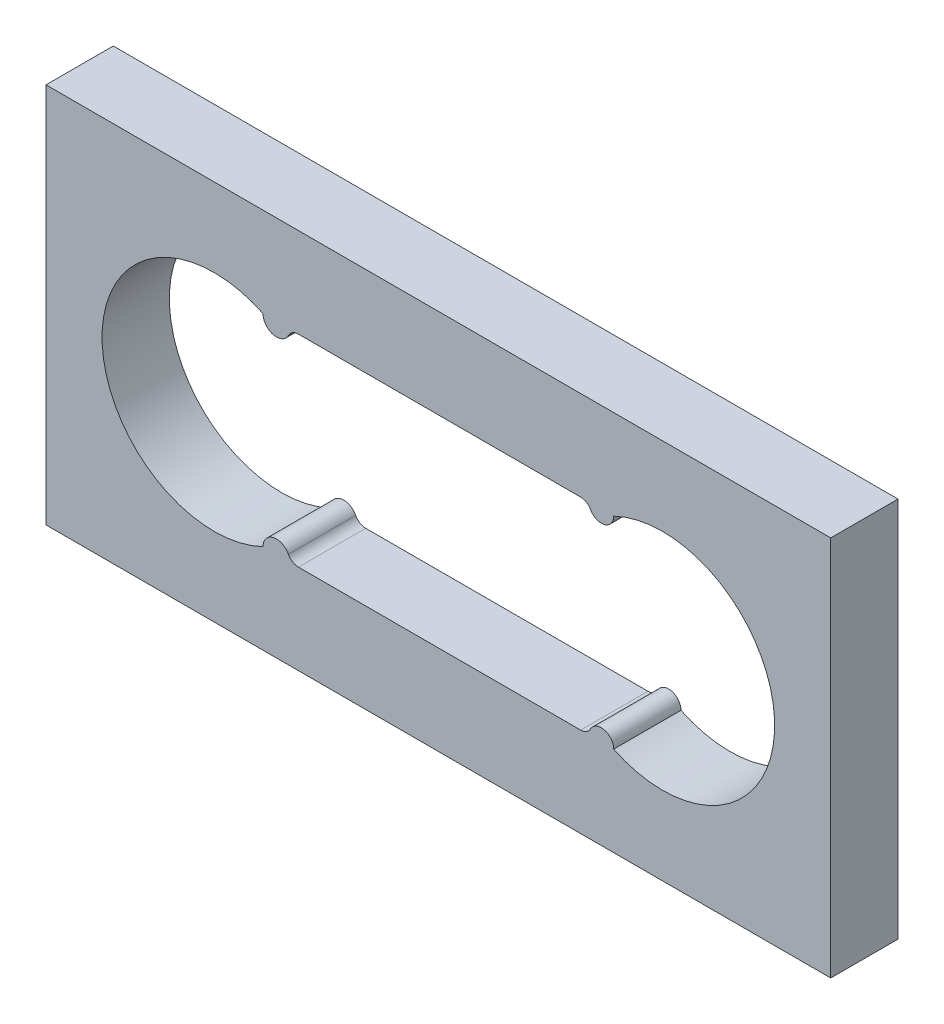
ISO-10303-21;
HEADER;
FILE_DESCRIPTION(('STEP AP214'),'2;1');
FILE_NAME('part.step','',(''),(''),'','','');
FILE_SCHEMA(('AUTOMOTIVE_DESIGN { 1 0 10303 214 1 1 1 1 }'));
ENDSEC;
DATA;
#1=APPLICATION_CONTEXT('core data for automotive mechanical design processes');
#2=APPLICATION_PROTOCOL_DEFINITION('international standard','automotive_design',2000,#1);
#3=PRODUCT_CONTEXT('',#1,'mechanical');
#4=PRODUCT('Part','Part','',(#3));
#5=PRODUCT_RELATED_PRODUCT_CATEGORY('part','',(#4));
#6=PRODUCT_DEFINITION_FORMATION('','',#4);
#7=PRODUCT_DEFINITION_CONTEXT('part definition',#1,'design');
#8=PRODUCT_DEFINITION('design','',#6,#7);
#9=PRODUCT_DEFINITION_SHAPE('','',#8);
#10=(LENGTH_UNIT() NAMED_UNIT(*) SI_UNIT(.MILLI.,.METRE.));
#11=(NAMED_UNIT(*) PLANE_ANGLE_UNIT() SI_UNIT($,.RADIAN.));
#12=(NAMED_UNIT(*) SI_UNIT($,.STERADIAN.) SOLID_ANGLE_UNIT());
#13=UNCERTAINTY_MEASURE_WITH_UNIT(LENGTH_MEASURE(1.E-05),#10,'distance_accuracy_value','');
#14=(GEOMETRIC_REPRESENTATION_CONTEXT(3) GLOBAL_UNCERTAINTY_ASSIGNED_CONTEXT((#13)) GLOBAL_UNIT_ASSIGNED_CONTEXT((#10,
#11,#12)) REPRESENTATION_CONTEXT('',''));
#15=CARTESIAN_POINT('',(0.,0.,0.));
#16=DIRECTION('',(0.,0.,1.));
#17=DIRECTION('',(1.,0.,0.));
#18=AXIS2_PLACEMENT_3D('',#15,#16,#17);
#19=CARTESIAN_POINT('',(0.,-8.5,3.));
#20=DIRECTION('',(0.,1.,0.));
#21=DIRECTION('',(0.,0.,1.));
#22=AXIS2_PLACEMENT_3D('',#19,#20,#21);
#23=PLANE('',#22);
#24=DIRECTION('',(1.,0.,0.));
#25=VECTOR('',#24,1.);
#26=CARTESIAN_POINT('',(0.,-8.5,0.));
#27=LINE('',#26,#25);
#28=CARTESIAN_POINT('',(-17.5,-8.5,0.));
#29=VERTEX_POINT('',#28);
#30=CARTESIAN_POINT('',(17.5,-8.5,0.));
#31=VERTEX_POINT('',#30);
#32=EDGE_CURVE('E204',#29,#31,#27,.T.);
#33=ORIENTED_EDGE('',*,*,#32,.T.);
#34=DIRECTION('',(0.,0.,-1.));
#35=VECTOR('',#34,1.);
#36=CARTESIAN_POINT('',(17.5,-8.5,3.));
#37=LINE('',#36,#35);
#38=CARTESIAN_POINT('',(17.5,-8.5,3.));
#39=VERTEX_POINT('',#38);
#40=EDGE_CURVE('E230',#39,#31,#37,.T.);
#41=ORIENTED_EDGE('',*,*,#40,.F.);
#42=DIRECTION('',(1.,0.,0.));
#43=VECTOR('',#42,1.);
#44=CARTESIAN_POINT('',(0.,-8.5,3.));
#45=LINE('',#44,#43);
#46=CARTESIAN_POINT('',(-17.5,-8.5,3.));
#47=VERTEX_POINT('',#46);
#48=EDGE_CURVE('E294',#47,#39,#45,.T.);
#49=ORIENTED_EDGE('',*,*,#48,.F.);
#50=DIRECTION('',(0.,0.,-1.));
#51=VECTOR('',#50,1.);
#52=CARTESIAN_POINT('',(-17.5,-8.5,3.));
#53=LINE('',#52,#51);
#54=EDGE_CURVE('E220',#47,#29,#53,.T.);
#55=ORIENTED_EDGE('',*,*,#54,.T.);
#56=EDGE_LOOP('',(#33,#41,#49,#55));
#57=FACE_BOUND('',#56,.T.);
#58=ADVANCED_FACE('F41',(#57),#23,.F.);
#59=CARTESIAN_POINT('',(17.5,0.,3.));
#60=DIRECTION('',(-1.,0.,0.));
#61=DIRECTION('',(0.,0.,1.));
#62=AXIS2_PLACEMENT_3D('',#59,#60,#61);
#63=PLANE('',#62);
#64=DIRECTION('',(0.,1.,0.));
#65=VECTOR('',#64,1.);
#66=CARTESIAN_POINT('',(17.5,0.,0.));
#67=LINE('',#66,#65);
#68=CARTESIAN_POINT('',(17.5,8.5,0.));
#69=VERTEX_POINT('',#68);
#70=EDGE_CURVE('E208',#31,#69,#67,.T.);
#71=ORIENTED_EDGE('',*,*,#70,.T.);
#72=DIRECTION('',(0.,0.,-1.));
#73=VECTOR('',#72,1.);
#74=CARTESIAN_POINT('',(17.5,8.5,3.));
#75=LINE('',#74,#73);
#76=CARTESIAN_POINT('',(17.5,8.5,3.));
#77=VERTEX_POINT('',#76);
#78=EDGE_CURVE('E227',#77,#69,#75,.T.);
#79=ORIENTED_EDGE('',*,*,#78,.F.);
#80=DIRECTION('',(0.,1.,0.));
#81=VECTOR('',#80,1.);
#82=CARTESIAN_POINT('',(17.5,0.,3.));
#83=LINE('',#82,#81);
#84=EDGE_CURVE('E292',#39,#77,#83,.T.);
#85=ORIENTED_EDGE('',*,*,#84,.F.);
#86=ORIENTED_EDGE('',*,*,#40,.T.);
#87=EDGE_LOOP('',(#71,#79,#85,#86));
#88=FACE_BOUND('',#87,.T.);
#89=ADVANCED_FACE('F376',(#88),#63,.F.);
#90=CARTESIAN_POINT('',(0.,8.5,3.));
#91=DIRECTION('',(0.,1.,0.));
#92=DIRECTION('',(0.,0.,1.));
#93=AXIS2_PLACEMENT_3D('',#90,#91,#92);
#94=PLANE('',#93);
#95=DIRECTION('',(1.,0.,0.));
#96=VECTOR('',#95,1.);
#97=CARTESIAN_POINT('',(0.,8.5,0.));
#98=LINE('',#97,#96);
#99=CARTESIAN_POINT('',(-17.5,8.5,0.));
#100=VERTEX_POINT('',#99);
#101=EDGE_CURVE('E212',#100,#69,#98,.T.);
#102=ORIENTED_EDGE('',*,*,#101,.F.);
#103=DIRECTION('',(0.,0.,-1.));
#104=VECTOR('',#103,1.);
#105=CARTESIAN_POINT('',(-17.5,8.5,3.));
#106=LINE('',#105,#104);
#107=CARTESIAN_POINT('',(-17.5,8.5,3.));
#108=VERTEX_POINT('',#107);
#109=EDGE_CURVE('E223',#108,#100,#106,.T.);
#110=ORIENTED_EDGE('',*,*,#109,.F.);
#111=DIRECTION('',(1.,0.,0.));
#112=VECTOR('',#111,1.);
#113=CARTESIAN_POINT('',(0.,8.5,3.));
#114=LINE('',#113,#112);
#115=EDGE_CURVE('E289',#108,#77,#114,.T.);
#116=ORIENTED_EDGE('',*,*,#115,.T.);
#117=ORIENTED_EDGE('',*,*,#78,.T.);
#118=EDGE_LOOP('',(#102,#110,#116,#117));
#119=FACE_BOUND('',#118,.T.);
#120=ADVANCED_FACE('F382',(#119),#94,.T.);
#121=CARTESIAN_POINT('',(10.,0.,3.));
#122=DIRECTION('',(0.,0.,-1.));
#123=DIRECTION('',(-1.,0.,0.));
#124=AXIS2_PLACEMENT_3D('',#121,#122,#123);
#125=CYLINDRICAL_SURFACE('',#124,5.);
#126=CARTESIAN_POINT('',(10.,0.,0.));
#127=DIRECTION('',(0.,0.,1.));
#128=DIRECTION('',(1.,0.,0.));
#129=AXIS2_PLACEMENT_3D('',#126,#127,#128);
#130=CIRCLE('',#129,5.);
#131=CARTESIAN_POINT('',(7.82055052822967,-4.5,0.));
#132=VERTEX_POINT('',#131);
#133=CARTESIAN_POINT('',(7.82055052822966,4.5,0.));
#134=VERTEX_POINT('',#133);
#135=EDGE_CURVE('E171',#132,#134,#130,.T.);
#136=ORIENTED_EDGE('',*,*,#135,.F.);
#137=DIRECTION('',(0.,0.,-1.));
#138=VECTOR('',#137,1.);
#139=CARTESIAN_POINT('',(7.82055052822967,-4.5,3.));
#140=LINE('',#139,#138);
#141=CARTESIAN_POINT('',(7.82055052822967,-4.5,3.));
#142=VERTEX_POINT('',#141);
#143=EDGE_CURVE('E224',#142,#132,#140,.T.);
#144=ORIENTED_EDGE('',*,*,#143,.F.);
#145=CARTESIAN_POINT('',(10.,0.,3.));
#146=DIRECTION('',(0.,0.,1.));
#147=DIRECTION('',(1.,0.,0.));
#148=AXIS2_PLACEMENT_3D('',#145,#146,#147);
#149=CIRCLE('',#148,5.);
#150=CARTESIAN_POINT('',(7.82055052822966,4.5,3.));
#151=VERTEX_POINT('',#150);
#152=EDGE_CURVE('E173',#142,#151,#149,.T.);
#153=ORIENTED_EDGE('',*,*,#152,.T.);
#154=DIRECTION('',(0.,0.,-1.));
#155=VECTOR('',#154,1.);
#156=CARTESIAN_POINT('',(7.82055052822966,4.5,3.));
#157=LINE('',#156,#155);
#158=EDGE_CURVE('E158',#151,#134,#157,.T.);
#159=ORIENTED_EDGE('',*,*,#158,.T.);
#160=EDGE_LOOP('',(#136,#144,#153,#159));
#161=FACE_BOUND('',#160,.T.);
#162=ADVANCED_FACE('F169',(#161),#125,.F.);
#163=CARTESIAN_POINT('',(0.,-4.5,3.));
#164=DIRECTION('',(0.,1.,0.));
#165=DIRECTION('',(0.,0.,1.));
#166=AXIS2_PLACEMENT_3D('',#163,#164,#165);
#167=PLANE('',#166);
#168=DIRECTION('',(1.,0.,0.));
#169=VECTOR('',#168,1.);
#170=CARTESIAN_POINT('',(0.,-4.5,3.));
#171=LINE('',#170,#169);
#172=CARTESIAN_POINT('',(-6.24075463111639,-4.5,3.));
#173=VERTEX_POINT('',#172);
#174=CARTESIAN_POINT('',(6.3472412625987,-4.5,3.));
#175=VERTEX_POINT('',#174);
#176=EDGE_CURVE('E306',#173,#175,#171,.T.);
#177=ORIENTED_EDGE('',*,*,#176,.T.);
#178=DIRECTION('',(0.,0.,-1.));
#179=VECTOR('',#178,1.);
#180=CARTESIAN_POINT('',(6.3472412625987,-4.5,0.));
#181=LINE('',#180,#179);
#182=CARTESIAN_POINT('',(6.3472412625987,-4.5,0.));
#183=VERTEX_POINT('',#182);
#184=EDGE_CURVE('E259',#175,#183,#181,.T.);
#185=ORIENTED_EDGE('',*,*,#184,.T.);
#186=DIRECTION('',(1.,0.,0.));
#187=VECTOR('',#186,1.);
#188=CARTESIAN_POINT('',(0.,-4.5,0.));
#189=LINE('',#188,#187);
#190=CARTESIAN_POINT('',(-6.24075463111639,-4.5,0.));
#191=VERTEX_POINT('',#190);
#192=EDGE_CURVE('E184',#191,#183,#189,.T.);
#193=ORIENTED_EDGE('',*,*,#192,.F.);
#194=DIRECTION('',(0.,0.,-1.));
#195=VECTOR('',#194,1.);
#196=CARTESIAN_POINT('',(-6.24075463111639,-4.5,3.));
#197=LINE('',#196,#195);
#198=EDGE_CURVE('E256',#191,#173,#197,.F.);
#199=ORIENTED_EDGE('',*,*,#198,.T.);
#200=EDGE_LOOP('',(#177,#185,#193,#199));
#201=FACE_BOUND('',#200,.T.);
#202=ADVANCED_FACE('F358',(#201),#167,.T.);
#203=CARTESIAN_POINT('',(-10.,0.,3.));
#204=DIRECTION('',(0.,0.,-1.));
#205=DIRECTION('',(-1.,0.,0.));
#206=AXIS2_PLACEMENT_3D('',#203,#204,#205);
#207=CYLINDRICAL_SURFACE('',#206,5.);
#208=CARTESIAN_POINT('',(-10.,0.,0.));
#209=DIRECTION('',(0.,0.,1.));
#210=DIRECTION('',(1.,0.,0.));
#211=AXIS2_PLACEMENT_3D('',#208,#209,#210);
#212=CIRCLE('',#211,5.);
#213=CARTESIAN_POINT('',(-7.82055052822966,4.5,0.));
#214=VERTEX_POINT('',#213);
#215=CARTESIAN_POINT('',(-7.82055052822966,-4.5,0.));
#216=VERTEX_POINT('',#215);
#217=EDGE_CURVE('E190',#214,#216,#212,.T.);
#218=ORIENTED_EDGE('',*,*,#217,.F.);
#219=DIRECTION('',(0.,0.,-1.));
#220=VECTOR('',#219,1.);
#221=CARTESIAN_POINT('',(-7.82055052822966,4.5,3.));
#222=LINE('',#221,#220);
#223=CARTESIAN_POINT('',(-7.82055052822966,4.5,3.));
#224=VERTEX_POINT('',#223);
#225=EDGE_CURVE('E175',#224,#214,#222,.T.);
#226=ORIENTED_EDGE('',*,*,#225,.F.);
#227=CARTESIAN_POINT('',(-10.,0.,3.));
#228=DIRECTION('',(0.,0.,1.));
#229=DIRECTION('',(1.,0.,0.));
#230=AXIS2_PLACEMENT_3D('',#227,#228,#229);
#231=CIRCLE('',#230,5.);
#232=CARTESIAN_POINT('',(-7.82055052822966,-4.5,3.));
#233=VERTEX_POINT('',#232);
#234=EDGE_CURVE('E302',#224,#233,#231,.T.);
#235=ORIENTED_EDGE('',*,*,#234,.T.);
#236=DIRECTION('',(0.,0.,-1.));
#237=VECTOR('',#236,1.);
#238=CARTESIAN_POINT('',(-7.82055052822966,-4.5,3.));
#239=LINE('',#238,#237);
#240=EDGE_CURVE('E237',#233,#216,#239,.T.);
#241=ORIENTED_EDGE('',*,*,#240,.T.);
#242=EDGE_LOOP('',(#218,#226,#235,#241));
#243=FACE_BOUND('',#242,.T.);
#244=ADVANCED_FACE('F344',(#243),#207,.F.);
#245=CARTESIAN_POINT('',(0.,4.5,3.));
#246=DIRECTION('',(0.,1.,0.));
#247=DIRECTION('',(0.,0.,1.));
#248=AXIS2_PLACEMENT_3D('',#245,#246,#247);
#249=PLANE('',#248);
#250=DIRECTION('',(1.,0.,0.));
#251=VECTOR('',#250,1.);
#252=CARTESIAN_POINT('',(0.,4.5,0.));
#253=LINE('',#252,#251);
#254=CARTESIAN_POINT('',(-6.24075463111639,4.5,0.));
#255=VERTEX_POINT('',#254);
#256=CARTESIAN_POINT('',(6.34724126259869,4.5,0.));
#257=VERTEX_POINT('',#256);
#258=EDGE_CURVE('E200',#255,#257,#253,.T.);
#259=ORIENTED_EDGE('',*,*,#258,.T.);
#260=DIRECTION('',(0.,0.,1.));
#261=VECTOR('',#260,1.);
#262=CARTESIAN_POINT('',(6.34724126259869,4.5,3.));
#263=LINE('',#262,#261);
#264=CARTESIAN_POINT('',(6.34724126259869,4.5,3.));
#265=VERTEX_POINT('',#264);
#266=EDGE_CURVE('E246',#257,#265,#263,.T.);
#267=ORIENTED_EDGE('',*,*,#266,.T.);
#268=DIRECTION('',(1.,0.,0.));
#269=VECTOR('',#268,1.);
#270=CARTESIAN_POINT('',(0.,4.5,3.));
#271=LINE('',#270,#269);
#272=CARTESIAN_POINT('',(-6.24075463111639,4.5,3.));
#273=VERTEX_POINT('',#272);
#274=EDGE_CURVE('E298',#273,#265,#271,.T.);
#275=ORIENTED_EDGE('',*,*,#274,.F.);
#276=DIRECTION('',(0.,0.,1.));
#277=VECTOR('',#276,1.);
#278=CARTESIAN_POINT('',(-6.24075463111639,4.5,3.));
#279=LINE('',#278,#277);
#280=EDGE_CURVE('E233',#273,#255,#279,.F.);
#281=ORIENTED_EDGE('',*,*,#280,.T.);
#282=EDGE_LOOP('',(#259,#267,#275,#281));
#283=FACE_BOUND('',#282,.T.);
#284=ADVANCED_FACE('F334',(#283),#249,.F.);
#285=CARTESIAN_POINT('',(-17.5,0.,3.));
#286=DIRECTION('',(-1.,0.,0.));
#287=DIRECTION('',(0.,0.,1.));
#288=AXIS2_PLACEMENT_3D('',#285,#286,#287);
#289=PLANE('',#288);
#290=DIRECTION('',(0.,1.,0.));
#291=VECTOR('',#290,1.);
#292=CARTESIAN_POINT('',(-17.5,0.,0.));
#293=LINE('',#292,#291);
#294=EDGE_CURVE('E216',#29,#100,#293,.T.);
#295=ORIENTED_EDGE('',*,*,#294,.F.);
#296=ORIENTED_EDGE('',*,*,#54,.F.);
#297=DIRECTION('',(0.,1.,0.));
#298=VECTOR('',#297,1.);
#299=CARTESIAN_POINT('',(-17.5,0.,3.));
#300=LINE('',#299,#298);
#301=EDGE_CURVE('E176',#47,#108,#300,.T.);
#302=ORIENTED_EDGE('',*,*,#301,.T.);
#303=ORIENTED_EDGE('',*,*,#109,.T.);
#304=EDGE_LOOP('',(#295,#296,#302,#303));
#305=FACE_BOUND('',#304,.T.);
#306=ADVANCED_FACE('F389',(#305),#289,.T.);
#307=CARTESIAN_POINT('',(0.,0.,3.));
#308=DIRECTION('',(0.,0.,1.));
#309=DIRECTION('',(1.,0.,0.));
#310=AXIS2_PLACEMENT_3D('',#307,#308,#309);
#311=PLANE('',#310);
#312=CARTESIAN_POINT('',(-7.22055052822966,4.5,3.));
#313=DIRECTION('',(0.,0.,1.));
#314=DIRECTION('',(1.,0.,0.));
#315=AXIS2_PLACEMENT_3D('',#312,#313,#314);
#316=CIRCLE('',#315,0.6);
#317=CARTESIAN_POINT('',(-6.68611640253151,4.22727272727273,3.));
#318=VERTEX_POINT('',#317);
#319=EDGE_CURVE('E192',#224,#318,#316,.T.);
#320=ORIENTED_EDGE('',*,*,#319,.T.);
#321=CARTESIAN_POINT('',(-6.24075463111639,4.,3.));
#322=DIRECTION('',(0.,0.,1.));
#323=DIRECTION('',(1.,0.,0.));
#324=AXIS2_PLACEMENT_3D('',#321,#322,#323);
#325=CIRCLE('',#324,0.5);
#326=EDGE_CURVE('E11',#318,#273,#325,.F.);
#327=ORIENTED_EDGE('',*,*,#326,.T.);
#328=ORIENTED_EDGE('',*,*,#274,.T.);
#329=CARTESIAN_POINT('',(6.34724126259869,4.,3.));
#330=DIRECTION('',(0.,0.,1.));
#331=DIRECTION('',(1.,0.,0.));
#332=AXIS2_PLACEMENT_3D('',#329,#330,#331);
#333=CIRCLE('',#332,0.5);
#334=CARTESIAN_POINT('',(6.78691234147058,4.23809523809524,3.));
#335=VERTEX_POINT('',#334);
#336=EDGE_CURVE('E268',#265,#335,#333,.F.);
#337=ORIENTED_EDGE('',*,*,#336,.T.);
#338=CARTESIAN_POINT('',(7.27055052822966,4.5,3.));
#339=DIRECTION('',(0.,0.,1.));
#340=DIRECTION('',(1.,0.,0.));
#341=AXIS2_PLACEMENT_3D('',#338,#339,#340);
#342=CIRCLE('',#341,0.55);
#343=EDGE_CURVE('E166',#335,#151,#342,.T.);
#344=ORIENTED_EDGE('',*,*,#343,.T.);
#345=ORIENTED_EDGE('',*,*,#152,.F.);
#346=CARTESIAN_POINT('',(7.27055052822967,-4.5,3.));
#347=DIRECTION('',(0.,0.,1.));
#348=DIRECTION('',(1.,0.,0.));
#349=AXIS2_PLACEMENT_3D('',#346,#347,#348);
#350=CIRCLE('',#349,0.55);
#351=CARTESIAN_POINT('',(6.78691234147059,-4.23809523809524,3.));
#352=VERTEX_POINT('',#351);
#353=EDGE_CURVE('E165',#142,#352,#350,.T.);
#354=ORIENTED_EDGE('',*,*,#353,.T.);
#355=CARTESIAN_POINT('',(6.3472412625987,-4.,3.));
#356=DIRECTION('',(0.,0.,1.));
#357=DIRECTION('',(1.,0.,0.));
#358=AXIS2_PLACEMENT_3D('',#355,#356,#357);
#359=CIRCLE('',#358,0.5);
#360=EDGE_CURVE('E274',#352,#175,#359,.F.);
#361=ORIENTED_EDGE('',*,*,#360,.T.);
#362=ORIENTED_EDGE('',*,*,#176,.F.);
#363=CARTESIAN_POINT('',(-6.24075463111639,-4.,3.));
#364=DIRECTION('',(0.,0.,1.));
#365=DIRECTION('',(1.,0.,0.));
#366=AXIS2_PLACEMENT_3D('',#363,#364,#365);
#367=CIRCLE('',#366,0.5);
#368=CARTESIAN_POINT('',(-6.68611640253151,-4.22727272727273,3.));
#369=VERTEX_POINT('',#368);
#370=EDGE_CURVE('E283',#173,#369,#367,.F.);
#371=ORIENTED_EDGE('',*,*,#370,.T.);
#372=CARTESIAN_POINT('',(-7.22055052822966,-4.5,3.));
#373=DIRECTION('',(0.,0.,1.));
#374=DIRECTION('',(1.,0.,0.));
#375=AXIS2_PLACEMENT_3D('',#372,#373,#374);
#376=CIRCLE('',#375,0.6);
#377=EDGE_CURVE('E316',#369,#233,#376,.T.);
#378=ORIENTED_EDGE('',*,*,#377,.T.);
#379=ORIENTED_EDGE('',*,*,#234,.F.);
#380=EDGE_LOOP('',(#320,#327,#328,#337,#344,#345,#354,#361,#362,#371,#378,#379));
#381=FACE_BOUND('',#380,.T.);
#382=ORIENTED_EDGE('',*,*,#48,.T.);
#383=ORIENTED_EDGE('',*,*,#84,.T.);
#384=ORIENTED_EDGE('',*,*,#115,.F.);
#385=ORIENTED_EDGE('',*,*,#301,.F.);
#386=EDGE_LOOP('',(#382,#383,#384,#385));
#387=FACE_BOUND('',#386,.T.);
#388=ADVANCED_FACE('F328',(#381,#387),#311,.T.);
#389=CARTESIAN_POINT('',(0.,0.,0.));
#390=DIRECTION('',(0.,0.,1.));
#391=DIRECTION('',(1.,0.,0.));
#392=AXIS2_PLACEMENT_3D('',#389,#390,#391);
#393=PLANE('',#392);
#394=ORIENTED_EDGE('',*,*,#135,.T.);
#395=CARTESIAN_POINT('',(7.27055052822966,4.5,0.));
#396=DIRECTION('',(0.,0.,1.));
#397=DIRECTION('',(1.,0.,0.));
#398=AXIS2_PLACEMENT_3D('',#395,#396,#397);
#399=CIRCLE('',#398,0.55);
#400=CARTESIAN_POINT('',(6.78691234147058,4.23809523809524,0.));
#401=VERTEX_POINT('',#400);
#402=EDGE_CURVE('E154',#401,#134,#399,.T.);
#403=ORIENTED_EDGE('',*,*,#402,.F.);
#404=CARTESIAN_POINT('',(6.34724126259869,4.,0.));
#405=DIRECTION('',(0.,0.,1.));
#406=DIRECTION('',(1.,0.,0.));
#407=AXIS2_PLACEMENT_3D('',#404,#405,#406);
#408=CIRCLE('',#407,0.5);
#409=EDGE_CURVE('E271',#401,#257,#408,.T.);
#410=ORIENTED_EDGE('',*,*,#409,.T.);
#411=ORIENTED_EDGE('',*,*,#258,.F.);
#412=CARTESIAN_POINT('',(-6.24075463111639,4.,0.));
#413=DIRECTION('',(0.,0.,1.));
#414=DIRECTION('',(1.,0.,0.));
#415=AXIS2_PLACEMENT_3D('',#412,#413,#414);
#416=CIRCLE('',#415,0.5);
#417=CARTESIAN_POINT('',(-6.68611640253151,4.22727272727273,0.));
#418=VERTEX_POINT('',#417);
#419=EDGE_CURVE('E50',#255,#418,#416,.T.);
#420=ORIENTED_EDGE('',*,*,#419,.T.);
#421=CARTESIAN_POINT('',(-7.22055052822966,4.5,0.));
#422=DIRECTION('',(0.,0.,1.));
#423=DIRECTION('',(1.,0.,0.));
#424=AXIS2_PLACEMENT_3D('',#421,#422,#423);
#425=CIRCLE('',#424,0.6);
#426=EDGE_CURVE('E185',#214,#418,#425,.T.);
#427=ORIENTED_EDGE('',*,*,#426,.F.);
#428=ORIENTED_EDGE('',*,*,#217,.T.);
#429=CARTESIAN_POINT('',(-7.22055052822966,-4.5,0.));
#430=DIRECTION('',(0.,0.,1.));
#431=DIRECTION('',(1.,0.,0.));
#432=AXIS2_PLACEMENT_3D('',#429,#430,#431);
#433=CIRCLE('',#432,0.6);
#434=CARTESIAN_POINT('',(-6.68611640253151,-4.22727272727273,0.));
#435=VERTEX_POINT('',#434);
#436=EDGE_CURVE('E314',#435,#216,#433,.T.);
#437=ORIENTED_EDGE('',*,*,#436,.F.);
#438=CARTESIAN_POINT('',(-6.24075463111639,-4.,0.));
#439=DIRECTION('',(0.,0.,1.));
#440=DIRECTION('',(1.,0.,0.));
#441=AXIS2_PLACEMENT_3D('',#438,#439,#440);
#442=CIRCLE('',#441,0.5);
#443=EDGE_CURVE('E280',#435,#191,#442,.T.);
#444=ORIENTED_EDGE('',*,*,#443,.T.);
#445=ORIENTED_EDGE('',*,*,#192,.T.);
#446=CARTESIAN_POINT('',(6.3472412625987,-4.,0.));
#447=DIRECTION('',(0.,0.,1.));
#448=DIRECTION('',(1.,0.,0.));
#449=AXIS2_PLACEMENT_3D('',#446,#447,#448);
#450=CIRCLE('',#449,0.5);
#451=CARTESIAN_POINT('',(6.78691234147059,-4.23809523809524,0.));
#452=VERTEX_POINT('',#451);
#453=EDGE_CURVE('E277',#183,#452,#450,.T.);
#454=ORIENTED_EDGE('',*,*,#453,.T.);
#455=CARTESIAN_POINT('',(7.27055052822967,-4.5,0.));
#456=DIRECTION('',(0.,0.,1.));
#457=DIRECTION('',(1.,0.,0.));
#458=AXIS2_PLACEMENT_3D('',#455,#456,#457);
#459=CIRCLE('',#458,0.55);
#460=EDGE_CURVE('E182',#132,#452,#459,.T.);
#461=ORIENTED_EDGE('',*,*,#460,.F.);
#462=EDGE_LOOP('',(#394,#403,#410,#411,#420,#427,#428,#437,#444,#445,#454,#461));
#463=FACE_BOUND('',#462,.T.);
#464=ORIENTED_EDGE('',*,*,#32,.F.);
#465=ORIENTED_EDGE('',*,*,#294,.T.);
#466=ORIENTED_EDGE('',*,*,#101,.T.);
#467=ORIENTED_EDGE('',*,*,#70,.F.);
#468=EDGE_LOOP('',(#464,#465,#466,#467));
#469=FACE_BOUND('',#468,.T.);
#470=ADVANCED_FACE('F179',(#463,#469),#393,.F.);
#471=CARTESIAN_POINT('',(-7.22055052822966,4.5,0.));
#472=DIRECTION('',(0.,0.,1.));
#473=DIRECTION('',(1.,0.,0.));
#474=AXIS2_PLACEMENT_3D('',#471,#472,#473);
#475=CYLINDRICAL_SURFACE('',#474,0.6);
#476=ORIENTED_EDGE('',*,*,#426,.T.);
#477=DIRECTION('',(0.,0.,1.));
#478=VECTOR('',#477,1.);
#479=CARTESIAN_POINT('',(-6.68611640253151,4.22727272727273,0.));
#480=LINE('',#479,#478);
#481=EDGE_CURVE('E57',#418,#318,#480,.T.);
#482=ORIENTED_EDGE('',*,*,#481,.T.);
#483=ORIENTED_EDGE('',*,*,#319,.F.);
#484=ORIENTED_EDGE('',*,*,#225,.T.);
#485=EDGE_LOOP('',(#476,#482,#483,#484));
#486=FACE_BOUND('',#485,.T.);
#487=ADVANCED_FACE('F341',(#486),#475,.T.);
#488=CARTESIAN_POINT('',(-7.22055052822966,-4.5,0.));
#489=DIRECTION('',(0.,0.,1.));
#490=DIRECTION('',(1.,0.,0.));
#491=AXIS2_PLACEMENT_3D('',#488,#489,#490);
#492=CYLINDRICAL_SURFACE('',#491,0.6);
#493=ORIENTED_EDGE('',*,*,#377,.F.);
#494=DIRECTION('',(0.,0.,1.));
#495=VECTOR('',#494,1.);
#496=CARTESIAN_POINT('',(-6.68611640253151,-4.22727272727273,0.));
#497=LINE('',#496,#495);
#498=EDGE_CURVE('E262',#369,#435,#497,.F.);
#499=ORIENTED_EDGE('',*,*,#498,.T.);
#500=ORIENTED_EDGE('',*,*,#436,.T.);
#501=ORIENTED_EDGE('',*,*,#240,.F.);
#502=EDGE_LOOP('',(#493,#499,#500,#501));
#503=FACE_BOUND('',#502,.T.);
#504=ADVANCED_FACE('F350',(#503),#492,.T.);
#505=CARTESIAN_POINT('',(7.27055052822967,-4.5,0.));
#506=DIRECTION('',(0.,0.,1.));
#507=DIRECTION('',(1.,0.,0.));
#508=AXIS2_PLACEMENT_3D('',#505,#506,#507);
#509=CYLINDRICAL_SURFACE('',#508,0.55);
#510=ORIENTED_EDGE('',*,*,#460,.T.);
#511=DIRECTION('',(0.,0.,1.));
#512=VECTOR('',#511,1.);
#513=CARTESIAN_POINT('',(6.78691234147059,-4.23809523809524,0.));
#514=LINE('',#513,#512);
#515=EDGE_CURVE('E252',#452,#352,#514,.T.);
#516=ORIENTED_EDGE('',*,*,#515,.T.);
#517=ORIENTED_EDGE('',*,*,#353,.F.);
#518=ORIENTED_EDGE('',*,*,#143,.T.);
#519=EDGE_LOOP('',(#510,#516,#517,#518));
#520=FACE_BOUND('',#519,.T.);
#521=ADVANCED_FACE('F366',(#520),#509,.T.);
#522=CARTESIAN_POINT('',(7.27055052822966,4.5,0.));
#523=DIRECTION('',(0.,0.,1.));
#524=DIRECTION('',(1.,0.,0.));
#525=AXIS2_PLACEMENT_3D('',#522,#523,#524);
#526=CYLINDRICAL_SURFACE('',#525,0.55);
#527=ORIENTED_EDGE('',*,*,#343,.F.);
#528=DIRECTION('',(0.,0.,1.));
#529=VECTOR('',#528,1.);
#530=CARTESIAN_POINT('',(6.78691234147058,4.23809523809524,0.));
#531=LINE('',#530,#529);
#532=EDGE_CURVE('E161',#335,#401,#531,.F.);
#533=ORIENTED_EDGE('',*,*,#532,.T.);
#534=ORIENTED_EDGE('',*,*,#402,.T.);
#535=ORIENTED_EDGE('',*,*,#158,.F.);
#536=EDGE_LOOP('',(#527,#533,#534,#535));
#537=FACE_BOUND('',#536,.T.);
#538=ADVANCED_FACE('F157',(#537),#526,.T.);
#539=CARTESIAN_POINT('',(6.34724126259869,4.,0.));
#540=DIRECTION('',(0.,0.,1.));
#541=DIRECTION('',(1.,0.,0.));
#542=AXIS2_PLACEMENT_3D('',#539,#540,#541);
#543=CYLINDRICAL_SURFACE('',#542,0.5);
#544=ORIENTED_EDGE('',*,*,#409,.F.);
#545=ORIENTED_EDGE('',*,*,#532,.F.);
#546=ORIENTED_EDGE('',*,*,#336,.F.);
#547=ORIENTED_EDGE('',*,*,#266,.F.);
#548=EDGE_LOOP('',(#544,#545,#546,#547));
#549=FACE_BOUND('',#548,.T.);
#550=ADVANCED_FACE('F331',(#549),#543,.F.);
#551=CARTESIAN_POINT('',(6.3472412625987,-4.,0.));
#552=DIRECTION('',(0.,0.,1.));
#553=DIRECTION('',(1.,0.,0.));
#554=AXIS2_PLACEMENT_3D('',#551,#552,#553);
#555=CYLINDRICAL_SURFACE('',#554,0.5);
#556=ORIENTED_EDGE('',*,*,#453,.F.);
#557=ORIENTED_EDGE('',*,*,#184,.F.);
#558=ORIENTED_EDGE('',*,*,#360,.F.);
#559=ORIENTED_EDGE('',*,*,#515,.F.);
#560=EDGE_LOOP('',(#556,#557,#558,#559));
#561=FACE_BOUND('',#560,.T.);
#562=ADVANCED_FACE('F364',(#561),#555,.F.);
#563=CARTESIAN_POINT('',(-6.24075463111639,-4.,0.));
#564=DIRECTION('',(0.,0.,1.));
#565=DIRECTION('',(1.,0.,0.));
#566=AXIS2_PLACEMENT_3D('',#563,#564,#565);
#567=CYLINDRICAL_SURFACE('',#566,0.5);
#568=ORIENTED_EDGE('',*,*,#370,.F.);
#569=ORIENTED_EDGE('',*,*,#198,.F.);
#570=ORIENTED_EDGE('',*,*,#443,.F.);
#571=ORIENTED_EDGE('',*,*,#498,.F.);
#572=EDGE_LOOP('',(#568,#569,#570,#571));
#573=FACE_BOUND('',#572,.T.);
#574=ADVANCED_FACE('F354',(#573),#567,.F.);
#575=CARTESIAN_POINT('',(-6.24075463111639,4.,0.));
#576=DIRECTION('',(0.,0.,1.));
#577=DIRECTION('',(1.,0.,0.));
#578=AXIS2_PLACEMENT_3D('',#575,#576,#577);
#579=CYLINDRICAL_SURFACE('',#578,0.5);
#580=ORIENTED_EDGE('',*,*,#326,.F.);
#581=ORIENTED_EDGE('',*,*,#481,.F.);
#582=ORIENTED_EDGE('',*,*,#419,.F.);
#583=ORIENTED_EDGE('',*,*,#280,.F.);
#584=EDGE_LOOP('',(#580,#581,#582,#583));
#585=FACE_BOUND('',#584,.T.);
#586=ADVANCED_FACE('F43',(#585),#579,.F.);
#587=CLOSED_SHELL('',(#58,#89,#120,#162,#202,#244,#284,#306,#388,#470,#487,#504,#521,#538,#550,
#562,#574,#586));
#588=MANIFOLD_SOLID_BREP('B2',#587);
#589=ADVANCED_BREP_SHAPE_REPRESENTATION('',(#18,#588),#14);
#590=SHAPE_DEFINITION_REPRESENTATION(#9,#589);
ENDSEC;
END-ISO-10303-21;
